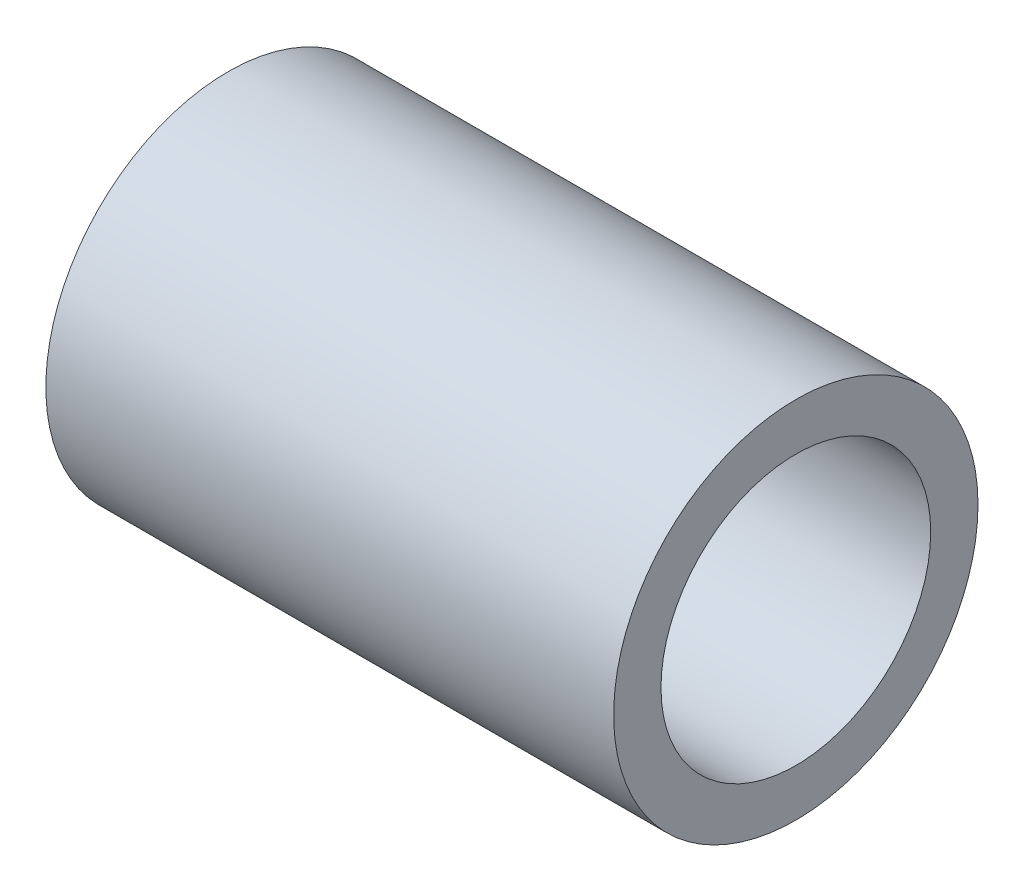
ISO-10303-21;
HEADER;
FILE_DESCRIPTION(('STEP AP214'),'2;1');
FILE_NAME('part.step','',(''),(''),'','','');
FILE_SCHEMA(('AUTOMOTIVE_DESIGN { 1 0 10303 214 1 1 1 1 }'));
ENDSEC;
DATA;
#1=APPLICATION_CONTEXT('core data for automotive mechanical design processes');
#2=APPLICATION_PROTOCOL_DEFINITION('international standard','automotive_design',2000,#1);
#3=PRODUCT_CONTEXT('',#1,'mechanical');
#4=PRODUCT('Part','Part','',(#3));
#5=PRODUCT_RELATED_PRODUCT_CATEGORY('part','',(#4));
#6=PRODUCT_DEFINITION_FORMATION('','',#4);
#7=PRODUCT_DEFINITION_CONTEXT('part definition',#1,'design');
#8=PRODUCT_DEFINITION('design','',#6,#7);
#9=PRODUCT_DEFINITION_SHAPE('','',#8);
#10=(LENGTH_UNIT() NAMED_UNIT(*) SI_UNIT(.MILLI.,.METRE.));
#11=(NAMED_UNIT(*) PLANE_ANGLE_UNIT() SI_UNIT($,.RADIAN.));
#12=(NAMED_UNIT(*) SI_UNIT($,.STERADIAN.) SOLID_ANGLE_UNIT());
#13=UNCERTAINTY_MEASURE_WITH_UNIT(LENGTH_MEASURE(1.E-05),#10,'distance_accuracy_value','');
#14=(GEOMETRIC_REPRESENTATION_CONTEXT(3) GLOBAL_UNCERTAINTY_ASSIGNED_CONTEXT((#13)) GLOBAL_UNIT_ASSIGNED_CONTEXT((#10,
#11,#12)) REPRESENTATION_CONTEXT('',''));
#15=CARTESIAN_POINT('',(0.,0.,0.));
#16=DIRECTION('',(0.,0.,1.));
#17=DIRECTION('',(1.,0.,0.));
#18=AXIS2_PLACEMENT_3D('',#15,#16,#17);
#19=CARTESIAN_POINT('',(16.,0.,0.));
#20=DIRECTION('',(1.,0.,0.));
#21=DIRECTION('',(0.,0.,-1.));
#22=AXIS2_PLACEMENT_3D('',#19,#20,#21);
#23=PLANE('',#22);
#24=DIRECTION('',(0.,-1.,0.));
#25=VECTOR('',#24,1.);
#26=CARTESIAN_POINT('',(16.,7.73175271203108,-3.65));
#27=LINE('',#26,#25);
#28=CARTESIAN_POINT('',(16.,7.73175271203108,-3.65));
#29=VERTEX_POINT('',#28);
#30=CARTESIAN_POINT('',(16.,-7.73175271203108,-3.65));
#31=VERTEX_POINT('',#30);
#32=EDGE_CURVE('E83',#29,#31,#27,.T.);
#33=ORIENTED_EDGE('',*,*,#32,.F.);
#34=CARTESIAN_POINT('',(16.,0.,0.));
#35=DIRECTION('',(1.,0.,0.));
#36=DIRECTION('',(0.,0.,-1.));
#37=AXIS2_PLACEMENT_3D('',#34,#35,#36);
#38=CIRCLE('',#37,8.55);
#39=CARTESIAN_POINT('',(16.,7.73175271203108,3.65));
#40=VERTEX_POINT('',#39);
#41=EDGE_CURVE('E48',#29,#40,#38,.T.);
#42=ORIENTED_EDGE('',*,*,#41,.T.);
#43=DIRECTION('',(0.,-1.,0.));
#44=VECTOR('',#43,1.);
#45=CARTESIAN_POINT('',(16.,7.73175271203108,3.65));
#46=LINE('',#45,#44);
#47=CARTESIAN_POINT('',(16.,-7.73175271203108,3.65));
#48=VERTEX_POINT('',#47);
#49=EDGE_CURVE('E80',#40,#48,#46,.T.);
#50=ORIENTED_EDGE('',*,*,#49,.T.);
#51=EDGE_CURVE('E11',#48,#31,#38,.T.);
#52=ORIENTED_EDGE('',*,*,#51,.T.);
#53=EDGE_LOOP('',(#33,#42,#50,#52));
#54=FACE_BOUND('',#53,.T.);
#55=ADVANCED_FACE('F38',(#54),#23,.T.);
#56=CARTESIAN_POINT('',(12.,0.,0.));
#57=DIRECTION('',(-1.,0.,0.));
#58=DIRECTION('',(0.,0.,1.));
#59=AXIS2_PLACEMENT_3D('',#56,#57,#58);
#60=CYLINDRICAL_SURFACE('',#59,8.55);
#61=ORIENTED_EDGE('',*,*,#51,.F.);
#62=DIRECTION('',(-1.,0.,0.));
#63=VECTOR('',#62,1.);
#64=CARTESIAN_POINT('',(16.,-7.73175271203108,3.65));
#65=LINE('',#64,#63);
#66=CARTESIAN_POINT('',(12.,-7.73175271203108,3.65));
#67=VERTEX_POINT('',#66);
#68=EDGE_CURVE('E92',#48,#67,#65,.T.);
#69=ORIENTED_EDGE('',*,*,#68,.T.);
#70=CARTESIAN_POINT('',(12.,0.,0.));
#71=DIRECTION('',(1.,0.,0.));
#72=DIRECTION('',(0.,0.,-1.));
#73=AXIS2_PLACEMENT_3D('',#70,#71,#72);
#74=CIRCLE('',#73,8.55);
#75=CARTESIAN_POINT('',(12.,-7.73175271203108,-3.65));
#76=VERTEX_POINT('',#75);
#77=EDGE_CURVE('E99',#67,#76,#74,.T.);
#78=ORIENTED_EDGE('',*,*,#77,.T.);
#79=DIRECTION('',(-1.,0.,0.));
#80=VECTOR('',#79,1.);
#81=CARTESIAN_POINT('',(16.,-7.73175271203108,-3.65));
#82=LINE('',#81,#80);
#83=EDGE_CURVE('E109',#31,#76,#82,.T.);
#84=ORIENTED_EDGE('',*,*,#83,.F.);
#85=EDGE_LOOP('',(#61,#69,#78,#84));
#86=FACE_BOUND('',#85,.T.);
#87=CARTESIAN_POINT('',(0.,0.,0.));
#88=DIRECTION('',(1.,0.,0.));
#89=DIRECTION('',(0.,0.,-1.));
#90=AXIS2_PLACEMENT_3D('',#87,#88,#89);
#91=CIRCLE('',#90,8.55);
#92=CARTESIAN_POINT('',(0.,0.,-8.55));
#93=VERTEX_POINT('',#92);
#94=EDGE_CURVE('E91',#93,#93,#91,.T.);
#95=ORIENTED_EDGE('',*,*,#94,.F.);
#96=EDGE_LOOP('',(#95));
#97=FACE_BOUND('',#96,.T.);
#98=CARTESIAN_POINT('',(12.,0.,0.));
#99=DIRECTION('',(1.,0.,0.));
#100=DIRECTION('',(0.,0.,-1.));
#101=AXIS2_PLACEMENT_3D('',#98,#99,#100);
#102=CIRCLE('',#101,8.55);
#103=CARTESIAN_POINT('',(12.,7.73175271203108,-3.65));
#104=VERTEX_POINT('',#103);
#105=CARTESIAN_POINT('',(12.,7.73175271203108,3.65));
#106=VERTEX_POINT('',#105);
#107=EDGE_CURVE('E55',#104,#106,#102,.T.);
#108=ORIENTED_EDGE('',*,*,#107,.T.);
#109=DIRECTION('',(-1.,0.,0.));
#110=VECTOR('',#109,1.);
#111=CARTESIAN_POINT('',(16.,7.73175271203108,3.65));
#112=LINE('',#111,#110);
#113=EDGE_CURVE('E86',#40,#106,#112,.T.);
#114=ORIENTED_EDGE('',*,*,#113,.F.);
#115=ORIENTED_EDGE('',*,*,#41,.F.);
#116=DIRECTION('',(-1.,0.,0.));
#117=VECTOR('',#116,1.);
#118=CARTESIAN_POINT('',(16.,7.73175271203108,-3.65));
#119=LINE('',#118,#117);
#120=EDGE_CURVE('E60',#29,#104,#119,.T.);
#121=ORIENTED_EDGE('',*,*,#120,.T.);
#122=EDGE_LOOP('',(#108,#114,#115,#121));
#123=FACE_BOUND('',#122,.T.);
#124=CARTESIAN_POINT('',(36.,0.,0.));
#125=DIRECTION('',(1.,0.,0.));
#126=DIRECTION('',(0.,0.,-1.));
#127=AXIS2_PLACEMENT_3D('',#124,#125,#126);
#128=CIRCLE('',#127,8.55);
#129=CARTESIAN_POINT('',(36.,0.,-8.55));
#130=VERTEX_POINT('',#129);
#131=EDGE_CURVE('E84',#130,#130,#128,.T.);
#132=ORIENTED_EDGE('',*,*,#131,.T.);
#133=EDGE_LOOP('',(#132));
#134=FACE_BOUND('',#133,.T.);
#135=ADVANCED_FACE('F87',(#86,#97,#123,#134),#60,.F.);
#136=CARTESIAN_POINT('',(0.,0.,0.));
#137=DIRECTION('',(1.,0.,0.));
#138=DIRECTION('',(0.,0.,-1.));
#139=AXIS2_PLACEMENT_3D('',#136,#137,#138);
#140=PLANE('',#139);
#141=CARTESIAN_POINT('',(0.,0.,0.));
#142=DIRECTION('',(1.,0.,0.));
#143=DIRECTION('',(0.,0.,-1.));
#144=AXIS2_PLACEMENT_3D('',#141,#142,#143);
#145=CIRCLE('',#144,11.55);
#146=CARTESIAN_POINT('',(0.,0.,-11.55));
#147=VERTEX_POINT('',#146);
#148=EDGE_CURVE('E42',#147,#147,#145,.T.);
#149=ORIENTED_EDGE('',*,*,#148,.F.);
#150=EDGE_LOOP('',(#149));
#151=FACE_BOUND('',#150,.T.);
#152=ORIENTED_EDGE('',*,*,#94,.T.);
#153=EDGE_LOOP('',(#152));
#154=FACE_BOUND('',#153,.T.);
#155=ADVANCED_FACE('F120',(#151,#154),#140,.F.);
#156=CARTESIAN_POINT('',(12.,0.,0.));
#157=DIRECTION('',(-1.,0.,0.));
#158=DIRECTION('',(0.,0.,1.));
#159=AXIS2_PLACEMENT_3D('',#156,#157,#158);
#160=CYLINDRICAL_SURFACE('',#159,11.55);
#161=ORIENTED_EDGE('',*,*,#148,.T.);
#162=EDGE_LOOP('',(#161));
#163=FACE_BOUND('',#162,.T.);
#164=CARTESIAN_POINT('',(36.,0.,0.));
#165=DIRECTION('',(1.,0.,0.));
#166=DIRECTION('',(0.,0.,-1.));
#167=AXIS2_PLACEMENT_3D('',#164,#165,#166);
#168=CIRCLE('',#167,11.55);
#169=CARTESIAN_POINT('',(36.,0.,-11.55));
#170=VERTEX_POINT('',#169);
#171=EDGE_CURVE('E102',#170,#170,#168,.T.);
#172=ORIENTED_EDGE('',*,*,#171,.F.);
#173=EDGE_LOOP('',(#172));
#174=FACE_BOUND('',#173,.T.);
#175=ADVANCED_FACE('F40',(#163,#174),#160,.T.);
#176=CARTESIAN_POINT('',(16.,7.73175271203108,3.65));
#177=DIRECTION('',(0.,0.,-1.));
#178=DIRECTION('',(0.,1.,0.));
#179=AXIS2_PLACEMENT_3D('',#176,#177,#178);
#180=PLANE('',#179);
#181=DIRECTION('',(0.,-1.,0.));
#182=VECTOR('',#181,1.);
#183=CARTESIAN_POINT('',(12.,7.73175271203108,3.65));
#184=LINE('',#183,#182);
#185=EDGE_CURVE('E105',#106,#67,#184,.T.);
#186=ORIENTED_EDGE('',*,*,#185,.T.);
#187=ORIENTED_EDGE('',*,*,#68,.F.);
#188=ORIENTED_EDGE('',*,*,#49,.F.);
#189=ORIENTED_EDGE('',*,*,#113,.T.);
#190=EDGE_LOOP('',(#186,#187,#188,#189));
#191=FACE_BOUND('',#190,.T.);
#192=ADVANCED_FACE('F94',(#191),#180,.F.);
#193=CARTESIAN_POINT('',(16.,7.73175271203108,-3.65));
#194=DIRECTION('',(0.,0.,-1.));
#195=DIRECTION('',(0.,1.,0.));
#196=AXIS2_PLACEMENT_3D('',#193,#194,#195);
#197=PLANE('',#196);
#198=DIRECTION('',(0.,-1.,0.));
#199=VECTOR('',#198,1.);
#200=CARTESIAN_POINT('',(12.,7.73175271203108,-3.65));
#201=LINE('',#200,#199);
#202=EDGE_CURVE('E95',#104,#76,#201,.T.);
#203=ORIENTED_EDGE('',*,*,#202,.F.);
#204=ORIENTED_EDGE('',*,*,#120,.F.);
#205=ORIENTED_EDGE('',*,*,#32,.T.);
#206=ORIENTED_EDGE('',*,*,#83,.T.);
#207=EDGE_LOOP('',(#203,#204,#205,#206));
#208=FACE_BOUND('',#207,.T.);
#209=ADVANCED_FACE('F135',(#208),#197,.T.);
#210=CARTESIAN_POINT('',(12.,0.,0.));
#211=DIRECTION('',(1.,0.,0.));
#212=DIRECTION('',(0.,0.,-1.));
#213=AXIS2_PLACEMENT_3D('',#210,#211,#212);
#214=PLANE('',#213);
#215=ORIENTED_EDGE('',*,*,#107,.F.);
#216=ORIENTED_EDGE('',*,*,#202,.T.);
#217=ORIENTED_EDGE('',*,*,#77,.F.);
#218=ORIENTED_EDGE('',*,*,#185,.F.);
#219=EDGE_LOOP('',(#215,#216,#217,#218));
#220=FACE_BOUND('',#219,.T.);
#221=ADVANCED_FACE('F138',(#220),#214,.F.);
#222=CARTESIAN_POINT('',(36.,0.,0.));
#223=DIRECTION('',(1.,0.,0.));
#224=DIRECTION('',(0.,0.,-1.));
#225=AXIS2_PLACEMENT_3D('',#222,#223,#224);
#226=PLANE('',#225);
#227=ORIENTED_EDGE('',*,*,#171,.T.);
#228=EDGE_LOOP('',(#227));
#229=FACE_BOUND('',#228,.T.);
#230=ORIENTED_EDGE('',*,*,#131,.F.);
#231=EDGE_LOOP('',(#230));
#232=FACE_BOUND('',#231,.T.);
#233=ADVANCED_FACE('F142',(#229,#232),#226,.T.);
#234=CLOSED_SHELL('',(#55,#135,#155,#175,#192,#209,#221,#233));
#235=MANIFOLD_SOLID_BREP('B2',#234);
#236=ADVANCED_BREP_SHAPE_REPRESENTATION('',(#18,#235),#14);
#237=SHAPE_DEFINITION_REPRESENTATION(#9,#236);
ENDSEC;
END-ISO-10303-21;
